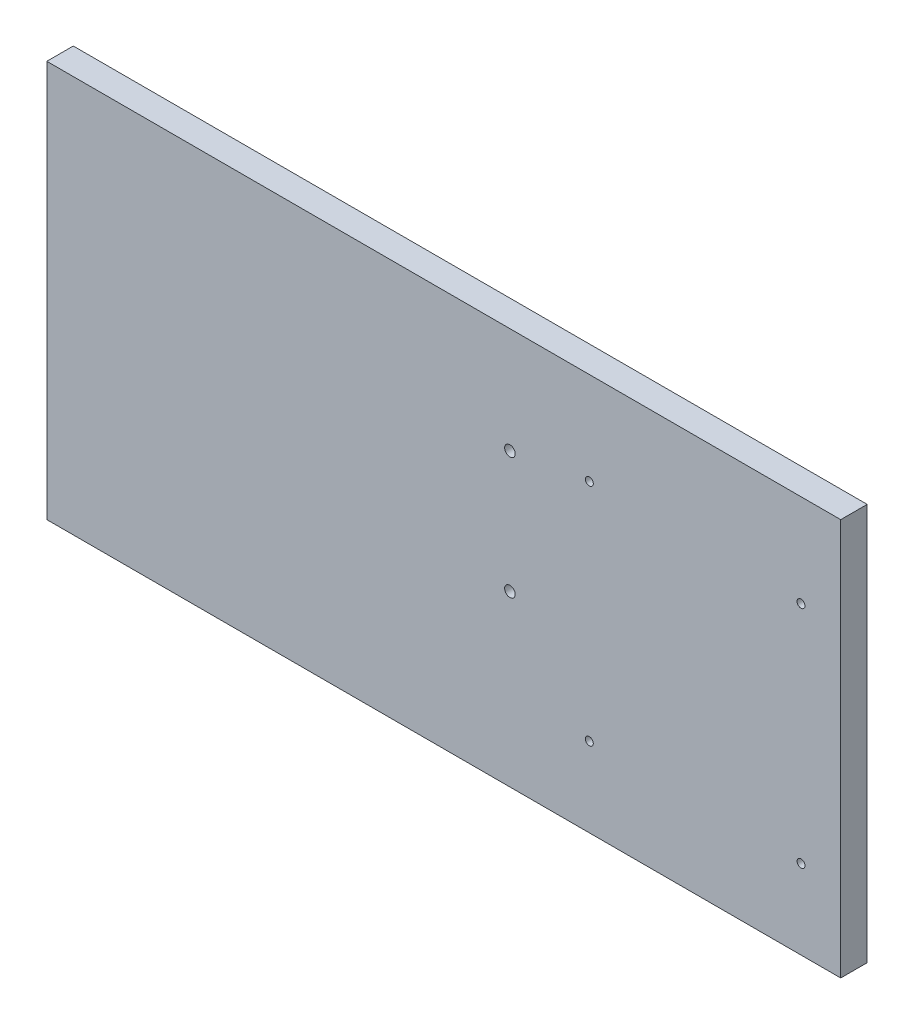
ISO-10303-21;
HEADER;
FILE_DESCRIPTION(('STEP AP214'),'2;1');
FILE_NAME('part.step','',(''),(''),'','','');
FILE_SCHEMA(('AUTOMOTIVE_DESIGN { 1 0 10303 214 1 1 1 1 }'));
ENDSEC;
DATA;
#1=APPLICATION_CONTEXT('core data for automotive mechanical design processes');
#2=APPLICATION_PROTOCOL_DEFINITION('international standard','automotive_design',2000,#1);
#3=PRODUCT_CONTEXT('',#1,'mechanical');
#4=PRODUCT('Part','Part','',(#3));
#5=PRODUCT_RELATED_PRODUCT_CATEGORY('part','',(#4));
#6=PRODUCT_DEFINITION_FORMATION('','',#4);
#7=PRODUCT_DEFINITION_CONTEXT('part definition',#1,'design');
#8=PRODUCT_DEFINITION('design','',#6,#7);
#9=PRODUCT_DEFINITION_SHAPE('','',#8);
#10=(LENGTH_UNIT() NAMED_UNIT(*) SI_UNIT(.MILLI.,.METRE.));
#11=(NAMED_UNIT(*) PLANE_ANGLE_UNIT() SI_UNIT($,.RADIAN.));
#12=(NAMED_UNIT(*) SI_UNIT($,.STERADIAN.) SOLID_ANGLE_UNIT());
#13=UNCERTAINTY_MEASURE_WITH_UNIT(LENGTH_MEASURE(1.E-05),#10,'distance_accuracy_value','');
#14=(GEOMETRIC_REPRESENTATION_CONTEXT(3) GLOBAL_UNCERTAINTY_ASSIGNED_CONTEXT((#13)) GLOBAL_UNIT_ASSIGNED_CONTEXT((#10,
#11,#12)) REPRESENTATION_CONTEXT('',''));
#15=CARTESIAN_POINT('',(0.,0.,0.));
#16=DIRECTION('',(0.,0.,1.));
#17=DIRECTION('',(1.,0.,0.));
#18=AXIS2_PLACEMENT_3D('',#15,#16,#17);
#19=CARTESIAN_POINT('',(150.,0.,10.));
#20=DIRECTION('',(1.,0.,0.));
#21=DIRECTION('',(0.,1.,0.));
#22=AXIS2_PLACEMENT_3D('',#19,#20,#21);
#23=PLANE('',#22);
#24=DIRECTION('',(0.,-1.,0.));
#25=VECTOR('',#24,1.);
#26=CARTESIAN_POINT('',(150.,0.,0.));
#27=LINE('',#26,#25);
#28=CARTESIAN_POINT('',(150.,75.,0.));
#29=VERTEX_POINT('',#28);
#30=CARTESIAN_POINT('',(150.,-75.,0.));
#31=VERTEX_POINT('',#30);
#32=EDGE_CURVE('E124',#29,#31,#27,.T.);
#33=ORIENTED_EDGE('',*,*,#32,.F.);
#34=DIRECTION('',(0.,0.,-1.));
#35=VECTOR('',#34,1.);
#36=CARTESIAN_POINT('',(150.,75.,10.));
#37=LINE('',#36,#35);
#38=CARTESIAN_POINT('',(150.,75.,10.));
#39=VERTEX_POINT('',#38);
#40=EDGE_CURVE('E11',#39,#29,#37,.T.);
#41=ORIENTED_EDGE('',*,*,#40,.F.);
#42=DIRECTION('',(0.,-1.,0.));
#43=VECTOR('',#42,1.);
#44=CARTESIAN_POINT('',(150.,0.,10.));
#45=LINE('',#44,#43);
#46=CARTESIAN_POINT('',(150.,-75.,10.));
#47=VERTEX_POINT('',#46);
#48=EDGE_CURVE('E99',#39,#47,#45,.T.);
#49=ORIENTED_EDGE('',*,*,#48,.T.);
#50=DIRECTION('',(0.,0.,-1.));
#51=VECTOR('',#50,1.);
#52=CARTESIAN_POINT('',(150.,-75.,10.));
#53=LINE('',#52,#51);
#54=EDGE_CURVE('E77',#47,#31,#53,.T.);
#55=ORIENTED_EDGE('',*,*,#54,.T.);
#56=EDGE_LOOP('',(#33,#41,#49,#55));
#57=FACE_BOUND('',#56,.T.);
#58=ADVANCED_FACE('F37',(#57),#23,.T.);
#59=CARTESIAN_POINT('',(0.,75.,10.));
#60=DIRECTION('',(0.,1.,0.));
#61=DIRECTION('',(-1.,0.,0.));
#62=AXIS2_PLACEMENT_3D('',#59,#60,#61);
#63=PLANE('',#62);
#64=DIRECTION('',(1.,0.,0.));
#65=VECTOR('',#64,1.);
#66=CARTESIAN_POINT('',(0.,75.,0.));
#67=LINE('',#66,#65);
#68=CARTESIAN_POINT('',(-150.,75.,0.));
#69=VERTEX_POINT('',#68);
#70=EDGE_CURVE('E89',#69,#29,#67,.T.);
#71=ORIENTED_EDGE('',*,*,#70,.F.);
#72=DIRECTION('',(0.,0.,-1.));
#73=VECTOR('',#72,1.);
#74=CARTESIAN_POINT('',(-150.,75.,10.));
#75=LINE('',#74,#73);
#76=CARTESIAN_POINT('',(-150.,75.,10.));
#77=VERTEX_POINT('',#76);
#78=EDGE_CURVE('E46',#77,#69,#75,.T.);
#79=ORIENTED_EDGE('',*,*,#78,.F.);
#80=DIRECTION('',(1.,0.,0.));
#81=VECTOR('',#80,1.);
#82=CARTESIAN_POINT('',(0.,75.,10.));
#83=LINE('',#82,#81);
#84=EDGE_CURVE('E87',#77,#39,#83,.T.);
#85=ORIENTED_EDGE('',*,*,#84,.T.);
#86=ORIENTED_EDGE('',*,*,#40,.T.);
#87=EDGE_LOOP('',(#71,#79,#85,#86));
#88=FACE_BOUND('',#87,.T.);
#89=ADVANCED_FACE('F85',(#88),#63,.T.);
#90=CARTESIAN_POINT('',(-150.,0.,10.));
#91=DIRECTION('',(1.,0.,0.));
#92=DIRECTION('',(0.,0.,-1.));
#93=AXIS2_PLACEMENT_3D('',#90,#91,#92);
#94=PLANE('',#93);
#95=DIRECTION('',(0.,-1.,0.));
#96=VECTOR('',#95,1.);
#97=CARTESIAN_POINT('',(-150.,0.,0.));
#98=LINE('',#97,#96);
#99=CARTESIAN_POINT('',(-150.,-75.,0.));
#100=VERTEX_POINT('',#99);
#101=EDGE_CURVE('E127',#69,#100,#98,.T.);
#102=ORIENTED_EDGE('',*,*,#101,.T.);
#103=DIRECTION('',(0.,0.,-1.));
#104=VECTOR('',#103,1.);
#105=CARTESIAN_POINT('',(-150.,-75.,10.));
#106=LINE('',#105,#104);
#107=CARTESIAN_POINT('',(-150.,-75.,10.));
#108=VERTEX_POINT('',#107);
#109=EDGE_CURVE('E92',#108,#100,#106,.T.);
#110=ORIENTED_EDGE('',*,*,#109,.F.);
#111=DIRECTION('',(0.,-1.,0.));
#112=VECTOR('',#111,1.);
#113=CARTESIAN_POINT('',(-150.,0.,10.));
#114=LINE('',#113,#112);
#115=EDGE_CURVE('E94',#77,#108,#114,.T.);
#116=ORIENTED_EDGE('',*,*,#115,.F.);
#117=ORIENTED_EDGE('',*,*,#78,.T.);
#118=EDGE_LOOP('',(#102,#110,#116,#117));
#119=FACE_BOUND('',#118,.T.);
#120=ADVANCED_FACE('F95',(#119),#94,.F.);
#121=CARTESIAN_POINT('',(0.,-75.,10.));
#122=DIRECTION('',(0.,1.,0.));
#123=DIRECTION('',(0.,0.,1.));
#124=AXIS2_PLACEMENT_3D('',#121,#122,#123);
#125=PLANE('',#124);
#126=DIRECTION('',(1.,0.,0.));
#127=VECTOR('',#126,1.);
#128=CARTESIAN_POINT('',(0.,-75.,0.));
#129=LINE('',#128,#127);
#130=EDGE_CURVE('E70',#100,#31,#129,.T.);
#131=ORIENTED_EDGE('',*,*,#130,.T.);
#132=ORIENTED_EDGE('',*,*,#54,.F.);
#133=DIRECTION('',(1.,0.,0.));
#134=VECTOR('',#133,1.);
#135=CARTESIAN_POINT('',(0.,-75.,10.));
#136=LINE('',#135,#134);
#137=EDGE_CURVE('E54',#108,#47,#136,.T.);
#138=ORIENTED_EDGE('',*,*,#137,.F.);
#139=ORIENTED_EDGE('',*,*,#109,.T.);
#140=EDGE_LOOP('',(#131,#132,#138,#139));
#141=FACE_BOUND('',#140,.T.);
#142=ADVANCED_FACE('F136',(#141),#125,.F.);
#143=CARTESIAN_POINT('',(135.,39.9999999999995,10.));
#144=DIRECTION('',(0.,0.,-1.));
#145=DIRECTION('',(-1.,0.,0.));
#146=AXIS2_PLACEMENT_3D('',#143,#144,#145);
#147=CYLINDRICAL_SURFACE('',#146,1.5);
#148=CARTESIAN_POINT('',(135.,39.9999999999995,10.));
#149=DIRECTION('',(0.,0.,1.));
#150=DIRECTION('',(1.,0.,0.));
#151=AXIS2_PLACEMENT_3D('',#148,#149,#150);
#152=CIRCLE('',#151,1.5);
#153=CARTESIAN_POINT('',(136.5,39.9999999999995,10.));
#154=VERTEX_POINT('',#153);
#155=EDGE_CURVE('E101',#154,#154,#152,.T.);
#156=ORIENTED_EDGE('',*,*,#155,.T.);
#157=EDGE_LOOP('',(#156));
#158=FACE_BOUND('',#157,.T.);
#159=CARTESIAN_POINT('',(135.,39.9999999999995,0.));
#160=DIRECTION('',(0.,0.,1.));
#161=DIRECTION('',(1.,0.,0.));
#162=AXIS2_PLACEMENT_3D('',#159,#160,#161);
#163=CIRCLE('',#162,1.5);
#164=CARTESIAN_POINT('',(136.5,39.9999999999995,0.));
#165=VERTEX_POINT('',#164);
#166=EDGE_CURVE('E121',#165,#165,#163,.T.);
#167=ORIENTED_EDGE('',*,*,#166,.F.);
#168=EDGE_LOOP('',(#167));
#169=FACE_BOUND('',#168,.T.);
#170=ADVANCED_FACE('F147',(#158,#169),#147,.F.);
#171=CARTESIAN_POINT('',(135.,-45.0000000000005,10.));
#172=DIRECTION('',(0.,0.,-1.));
#173=DIRECTION('',(-1.,0.,0.));
#174=AXIS2_PLACEMENT_3D('',#171,#172,#173);
#175=CYLINDRICAL_SURFACE('',#174,1.5);
#176=CARTESIAN_POINT('',(135.,-45.0000000000005,10.));
#177=DIRECTION('',(0.,0.,1.));
#178=DIRECTION('',(1.,0.,0.));
#179=AXIS2_PLACEMENT_3D('',#176,#177,#178);
#180=CIRCLE('',#179,1.5);
#181=CARTESIAN_POINT('',(136.5,-45.0000000000005,10.));
#182=VERTEX_POINT('',#181);
#183=EDGE_CURVE('E279',#182,#182,#180,.F.);
#184=ORIENTED_EDGE('',*,*,#183,.F.);
#185=EDGE_LOOP('',(#184));
#186=FACE_BOUND('',#185,.T.);
#187=CARTESIAN_POINT('',(135.,-45.0000000000005,0.));
#188=DIRECTION('',(0.,0.,1.));
#189=DIRECTION('',(1.,0.,0.));
#190=AXIS2_PLACEMENT_3D('',#187,#188,#189);
#191=CIRCLE('',#190,1.5);
#192=CARTESIAN_POINT('',(136.5,-45.0000000000005,0.));
#193=VERTEX_POINT('',#192);
#194=EDGE_CURVE('E118',#193,#193,#191,.F.);
#195=ORIENTED_EDGE('',*,*,#194,.T.);
#196=EDGE_LOOP('',(#195));
#197=FACE_BOUND('',#196,.T.);
#198=ADVANCED_FACE('F150',(#186,#197),#175,.F.);
#199=CARTESIAN_POINT('',(55.0000000000001,39.9999999999995,10.));
#200=DIRECTION('',(0.,0.,-1.));
#201=DIRECTION('',(-1.,0.,0.));
#202=AXIS2_PLACEMENT_3D('',#199,#200,#201);
#203=CYLINDRICAL_SURFACE('',#202,1.5);
#204=CARTESIAN_POINT('',(55.0000000000001,39.9999999999995,10.));
#205=DIRECTION('',(0.,0.,1.));
#206=DIRECTION('',(1.,0.,0.));
#207=AXIS2_PLACEMENT_3D('',#204,#205,#206);
#208=CIRCLE('',#207,1.5);
#209=CARTESIAN_POINT('',(56.5000000000001,39.9999999999995,10.));
#210=VERTEX_POINT('',#209);
#211=EDGE_CURVE('E275',#210,#210,#208,.T.);
#212=ORIENTED_EDGE('',*,*,#211,.T.);
#213=EDGE_LOOP('',(#212));
#214=FACE_BOUND('',#213,.T.);
#215=CARTESIAN_POINT('',(55.0000000000001,39.9999999999995,0.));
#216=DIRECTION('',(0.,0.,1.));
#217=DIRECTION('',(1.,0.,0.));
#218=AXIS2_PLACEMENT_3D('',#215,#216,#217);
#219=CIRCLE('',#218,1.5);
#220=CARTESIAN_POINT('',(56.5000000000001,39.9999999999995,0.));
#221=VERTEX_POINT('',#220);
#222=EDGE_CURVE('E115',#221,#221,#219,.T.);
#223=ORIENTED_EDGE('',*,*,#222,.F.);
#224=EDGE_LOOP('',(#223));
#225=FACE_BOUND('',#224,.T.);
#226=ADVANCED_FACE('F154',(#214,#225),#203,.F.);
#227=CARTESIAN_POINT('',(25.0000000000001,35.,10.));
#228=DIRECTION('',(0.,0.,-1.));
#229=DIRECTION('',(-1.,0.,0.));
#230=AXIS2_PLACEMENT_3D('',#227,#228,#229);
#231=CYLINDRICAL_SURFACE('',#230,2.);
#232=CARTESIAN_POINT('',(25.0000000000001,35.,10.));
#233=DIRECTION('',(0.,0.,1.));
#234=DIRECTION('',(1.,0.,0.));
#235=AXIS2_PLACEMENT_3D('',#232,#233,#234);
#236=CIRCLE('',#235,2.);
#237=CARTESIAN_POINT('',(27.0000000000001,35.,10.));
#238=VERTEX_POINT('',#237);
#239=EDGE_CURVE('E169',#238,#238,#236,.T.);
#240=ORIENTED_EDGE('',*,*,#239,.T.);
#241=EDGE_LOOP('',(#240));
#242=FACE_BOUND('',#241,.T.);
#243=CARTESIAN_POINT('',(25.0000000000001,35.,0.));
#244=DIRECTION('',(0.,0.,1.));
#245=DIRECTION('',(1.,0.,0.));
#246=AXIS2_PLACEMENT_3D('',#243,#244,#245);
#247=CIRCLE('',#246,2.);
#248=CARTESIAN_POINT('',(27.0000000000001,35.,0.));
#249=VERTEX_POINT('',#248);
#250=EDGE_CURVE('E112',#249,#249,#247,.T.);
#251=ORIENTED_EDGE('',*,*,#250,.F.);
#252=EDGE_LOOP('',(#251));
#253=FACE_BOUND('',#252,.T.);
#254=ADVANCED_FACE('F157',(#242,#253),#231,.F.);
#255=CARTESIAN_POINT('',(25.0000000000001,-11.,10.));
#256=DIRECTION('',(0.,0.,-1.));
#257=DIRECTION('',(-1.,0.,0.));
#258=AXIS2_PLACEMENT_3D('',#255,#256,#257);
#259=CYLINDRICAL_SURFACE('',#258,2.);
#260=CARTESIAN_POINT('',(25.0000000000001,-11.,10.));
#261=DIRECTION('',(0.,0.,1.));
#262=DIRECTION('',(1.,0.,0.));
#263=AXIS2_PLACEMENT_3D('',#260,#261,#262);
#264=CIRCLE('',#263,2.);
#265=CARTESIAN_POINT('',(27.0000000000001,-11.,10.));
#266=VERTEX_POINT('',#265);
#267=EDGE_CURVE('E133',#266,#266,#264,.T.);
#268=ORIENTED_EDGE('',*,*,#267,.T.);
#269=EDGE_LOOP('',(#268));
#270=FACE_BOUND('',#269,.T.);
#271=CARTESIAN_POINT('',(25.0000000000001,-11.,0.));
#272=DIRECTION('',(0.,0.,1.));
#273=DIRECTION('',(1.,0.,0.));
#274=AXIS2_PLACEMENT_3D('',#271,#272,#273);
#275=CIRCLE('',#274,2.);
#276=CARTESIAN_POINT('',(27.0000000000001,-11.,0.));
#277=VERTEX_POINT('',#276);
#278=EDGE_CURVE('E109',#277,#277,#275,.T.);
#279=ORIENTED_EDGE('',*,*,#278,.F.);
#280=EDGE_LOOP('',(#279));
#281=FACE_BOUND('',#280,.T.);
#282=ADVANCED_FACE('F39',(#270,#281),#259,.F.);
#283=CARTESIAN_POINT('',(55.0000000000001,-45.0000000000006,10.));
#284=DIRECTION('',(0.,0.,-1.));
#285=DIRECTION('',(-1.,0.,0.));
#286=AXIS2_PLACEMENT_3D('',#283,#284,#285);
#287=CYLINDRICAL_SURFACE('',#286,1.5);
#288=CARTESIAN_POINT('',(55.0000000000001,-45.0000000000006,10.));
#289=DIRECTION('',(0.,0.,1.));
#290=DIRECTION('',(1.,0.,0.));
#291=AXIS2_PLACEMENT_3D('',#288,#289,#290);
#292=CIRCLE('',#291,1.5);
#293=CARTESIAN_POINT('',(56.5000000000001,-45.0000000000006,10.));
#294=VERTEX_POINT('',#293);
#295=EDGE_CURVE('E106',#294,#294,#292,.F.);
#296=ORIENTED_EDGE('',*,*,#295,.F.);
#297=EDGE_LOOP('',(#296));
#298=FACE_BOUND('',#297,.T.);
#299=CARTESIAN_POINT('',(55.0000000000001,-45.0000000000006,0.));
#300=DIRECTION('',(0.,0.,1.));
#301=DIRECTION('',(1.,0.,0.));
#302=AXIS2_PLACEMENT_3D('',#299,#300,#301);
#303=CIRCLE('',#302,1.5);
#304=CARTESIAN_POINT('',(56.5000000000001,-45.0000000000006,0.));
#305=VERTEX_POINT('',#304);
#306=EDGE_CURVE('E130',#305,#305,#303,.F.);
#307=ORIENTED_EDGE('',*,*,#306,.T.);
#308=EDGE_LOOP('',(#307));
#309=FACE_BOUND('',#308,.T.);
#310=ADVANCED_FACE('F164',(#298,#309),#287,.F.);
#311=CARTESIAN_POINT('',(0.,0.,10.));
#312=DIRECTION('',(0.,0.,1.));
#313=DIRECTION('',(1.,0.,0.));
#314=AXIS2_PLACEMENT_3D('',#311,#312,#313);
#315=PLANE('',#314);
#316=ORIENTED_EDGE('',*,*,#267,.F.);
#317=EDGE_LOOP('',(#316));
#318=FACE_BOUND('',#317,.T.);
#319=ORIENTED_EDGE('',*,*,#239,.F.);
#320=EDGE_LOOP('',(#319));
#321=FACE_BOUND('',#320,.T.);
#322=ORIENTED_EDGE('',*,*,#211,.F.);
#323=EDGE_LOOP('',(#322));
#324=FACE_BOUND('',#323,.T.);
#325=ORIENTED_EDGE('',*,*,#183,.T.);
#326=EDGE_LOOP('',(#325));
#327=FACE_BOUND('',#326,.T.);
#328=ORIENTED_EDGE('',*,*,#155,.F.);
#329=EDGE_LOOP('',(#328));
#330=FACE_BOUND('',#329,.T.);
#331=ORIENTED_EDGE('',*,*,#48,.F.);
#332=ORIENTED_EDGE('',*,*,#84,.F.);
#333=ORIENTED_EDGE('',*,*,#115,.T.);
#334=ORIENTED_EDGE('',*,*,#137,.T.);
#335=EDGE_LOOP('',(#331,#332,#333,#334));
#336=FACE_BOUND('',#335,.T.);
#337=ORIENTED_EDGE('',*,*,#295,.T.);
#338=EDGE_LOOP('',(#337));
#339=FACE_BOUND('',#338,.T.);
#340=ADVANCED_FACE('F97',(#318,#321,#324,#327,#330,#336,#339),#315,.T.);
#341=CARTESIAN_POINT('',(0.,0.,0.));
#342=DIRECTION('',(0.,0.,1.));
#343=DIRECTION('',(1.,0.,0.));
#344=AXIS2_PLACEMENT_3D('',#341,#342,#343);
#345=PLANE('',#344);
#346=ORIENTED_EDGE('',*,*,#278,.T.);
#347=EDGE_LOOP('',(#346));
#348=FACE_BOUND('',#347,.T.);
#349=ORIENTED_EDGE('',*,*,#250,.T.);
#350=EDGE_LOOP('',(#349));
#351=FACE_BOUND('',#350,.T.);
#352=ORIENTED_EDGE('',*,*,#222,.T.);
#353=EDGE_LOOP('',(#352));
#354=FACE_BOUND('',#353,.T.);
#355=ORIENTED_EDGE('',*,*,#194,.F.);
#356=EDGE_LOOP('',(#355));
#357=FACE_BOUND('',#356,.T.);
#358=ORIENTED_EDGE('',*,*,#166,.T.);
#359=EDGE_LOOP('',(#358));
#360=FACE_BOUND('',#359,.T.);
#361=ORIENTED_EDGE('',*,*,#32,.T.);
#362=ORIENTED_EDGE('',*,*,#130,.F.);
#363=ORIENTED_EDGE('',*,*,#101,.F.);
#364=ORIENTED_EDGE('',*,*,#70,.T.);
#365=EDGE_LOOP('',(#361,#362,#363,#364));
#366=FACE_BOUND('',#365,.T.);
#367=ORIENTED_EDGE('',*,*,#306,.F.);
#368=EDGE_LOOP('',(#367));
#369=FACE_BOUND('',#368,.T.);
#370=ADVANCED_FACE('F137',(#348,#351,#354,#357,#360,#366,#369),#345,.F.);
#371=CLOSED_SHELL('',(#58,#89,#120,#142,#170,#198,#226,#254,#282,#310,#340,#370));
#372=MANIFOLD_SOLID_BREP('B2',#371);
#373=ADVANCED_BREP_SHAPE_REPRESENTATION('',(#18,#372),#14);
#374=SHAPE_DEFINITION_REPRESENTATION(#9,#373);
ENDSEC;
END-ISO-10303-21;
